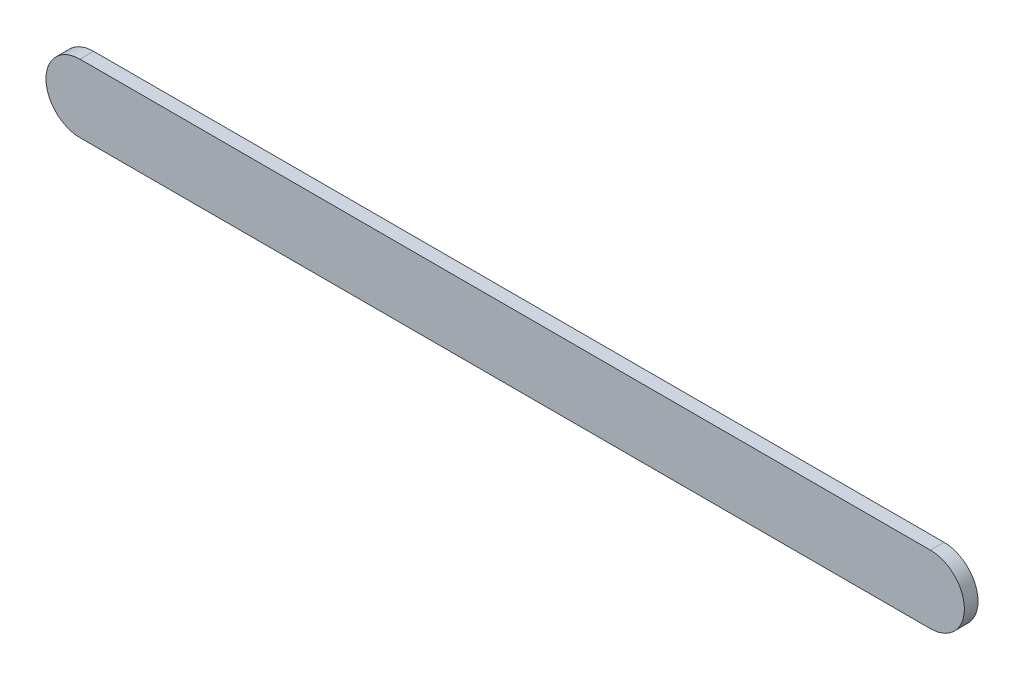
ISO-10303-21;
HEADER;
FILE_DESCRIPTION(('STEP AP214'),'2;1');
FILE_NAME('part.step','',(''),(''),'','','');
FILE_SCHEMA(('AUTOMOTIVE_DESIGN { 1 0 10303 214 1 1 1 1 }'));
ENDSEC;
DATA;
#1=APPLICATION_CONTEXT('core data for automotive mechanical design processes');
#2=APPLICATION_PROTOCOL_DEFINITION('international standard','automotive_design',2000,#1);
#3=PRODUCT_CONTEXT('',#1,'mechanical');
#4=PRODUCT('Part','Part','',(#3));
#5=PRODUCT_RELATED_PRODUCT_CATEGORY('part','',(#4));
#6=PRODUCT_DEFINITION_FORMATION('','',#4);
#7=PRODUCT_DEFINITION_CONTEXT('part definition',#1,'design');
#8=PRODUCT_DEFINITION('design','',#6,#7);
#9=PRODUCT_DEFINITION_SHAPE('','',#8);
#10=(LENGTH_UNIT() NAMED_UNIT(*) SI_UNIT(.MILLI.,.METRE.));
#11=(NAMED_UNIT(*) PLANE_ANGLE_UNIT() SI_UNIT($,.RADIAN.));
#12=(NAMED_UNIT(*) SI_UNIT($,.STERADIAN.) SOLID_ANGLE_UNIT());
#13=UNCERTAINTY_MEASURE_WITH_UNIT(LENGTH_MEASURE(1.E-05),#10,'distance_accuracy_value','');
#14=(GEOMETRIC_REPRESENTATION_CONTEXT(3) GLOBAL_UNCERTAINTY_ASSIGNED_CONTEXT((#13)) GLOBAL_UNIT_ASSIGNED_CONTEXT((#10,
#11,#12)) REPRESENTATION_CONTEXT('',''));
#15=CARTESIAN_POINT('',(0.,0.,0.));
#16=DIRECTION('',(0.,0.,1.));
#17=DIRECTION('',(1.,0.,0.));
#18=AXIS2_PLACEMENT_3D('',#15,#16,#17);
#19=CARTESIAN_POINT('',(0.,0.,1.));
#20=DIRECTION('',(0.,0.,-1.));
#21=DIRECTION('',(-1.,0.,0.));
#22=AXIS2_PLACEMENT_3D('',#19,#20,#21);
#23=CYLINDRICAL_SURFACE('',#22,5.);
#24=CARTESIAN_POINT('',(0.,0.,-1.));
#25=DIRECTION('',(0.,0.,1.));
#26=DIRECTION('',(1.,0.,0.));
#27=AXIS2_PLACEMENT_3D('',#24,#25,#26);
#28=CIRCLE('',#27,5.);
#29=CARTESIAN_POINT('',(0.,5.,-1.));
#30=VERTEX_POINT('',#29);
#31=CARTESIAN_POINT('',(0.,-5.,-1.));
#32=VERTEX_POINT('',#31);
#33=EDGE_CURVE('E102',#30,#32,#28,.T.);
#34=ORIENTED_EDGE('',*,*,#33,.T.);
#35=DIRECTION('',(0.,0.,-1.));
#36=VECTOR('',#35,1.);
#37=CARTESIAN_POINT('',(0.,-5.,1.));
#38=LINE('',#37,#36);
#39=CARTESIAN_POINT('',(0.,-5.,1.));
#40=VERTEX_POINT('',#39);
#41=EDGE_CURVE('E11',#40,#32,#38,.T.);
#42=ORIENTED_EDGE('',*,*,#41,.F.);
#43=CARTESIAN_POINT('',(0.,0.,1.));
#44=DIRECTION('',(0.,0.,1.));
#45=DIRECTION('',(1.,0.,0.));
#46=AXIS2_PLACEMENT_3D('',#43,#44,#45);
#47=CIRCLE('',#46,5.);
#48=CARTESIAN_POINT('',(0.,5.,1.));
#49=VERTEX_POINT('',#48);
#50=EDGE_CURVE('E90',#49,#40,#47,.T.);
#51=ORIENTED_EDGE('',*,*,#50,.F.);
#52=DIRECTION('',(0.,0.,-1.));
#53=VECTOR('',#52,1.);
#54=CARTESIAN_POINT('',(0.,5.,1.));
#55=LINE('',#54,#53);
#56=EDGE_CURVE('E98',#49,#30,#55,.T.);
#57=ORIENTED_EDGE('',*,*,#56,.T.);
#58=EDGE_LOOP('',(#34,#42,#51,#57));
#59=FACE_BOUND('',#58,.T.);
#60=ADVANCED_FACE('F39',(#59),#23,.T.);
#61=CARTESIAN_POINT('',(0.,-5.,1.));
#62=DIRECTION('',(0.,1.,0.));
#63=DIRECTION('',(0.,0.,1.));
#64=AXIS2_PLACEMENT_3D('',#61,#62,#63);
#65=PLANE('',#64);
#66=DIRECTION('',(1.,0.,0.));
#67=VECTOR('',#66,1.);
#68=CARTESIAN_POINT('',(0.,-5.,-1.));
#69=LINE('',#68,#67);
#70=CARTESIAN_POINT('',(125.,-5.,-1.));
#71=VERTEX_POINT('',#70);
#72=EDGE_CURVE('E94',#32,#71,#69,.T.);
#73=ORIENTED_EDGE('',*,*,#72,.T.);
#74=DIRECTION('',(0.,0.,-1.));
#75=VECTOR('',#74,1.);
#76=CARTESIAN_POINT('',(125.,-5.,1.));
#77=LINE('',#76,#75);
#78=CARTESIAN_POINT('',(125.,-5.,1.));
#79=VERTEX_POINT('',#78);
#80=EDGE_CURVE('E47',#79,#71,#77,.T.);
#81=ORIENTED_EDGE('',*,*,#80,.F.);
#82=DIRECTION('',(1.,0.,0.));
#83=VECTOR('',#82,1.);
#84=CARTESIAN_POINT('',(0.,-5.,1.));
#85=LINE('',#84,#83);
#86=EDGE_CURVE('E85',#40,#79,#85,.T.);
#87=ORIENTED_EDGE('',*,*,#86,.F.);
#88=ORIENTED_EDGE('',*,*,#41,.T.);
#89=EDGE_LOOP('',(#73,#81,#87,#88));
#90=FACE_BOUND('',#89,.T.);
#91=ADVANCED_FACE('F93',(#90),#65,.F.);
#92=CARTESIAN_POINT('',(125.,0.,1.));
#93=DIRECTION('',(0.,0.,-1.));
#94=DIRECTION('',(-1.,0.,0.));
#95=AXIS2_PLACEMENT_3D('',#92,#93,#94);
#96=CYLINDRICAL_SURFACE('',#95,5.);
#97=CARTESIAN_POINT('',(125.,0.,-1.));
#98=DIRECTION('',(0.,0.,1.));
#99=DIRECTION('',(1.,0.,0.));
#100=AXIS2_PLACEMENT_3D('',#97,#98,#99);
#101=CIRCLE('',#100,5.);
#102=CARTESIAN_POINT('',(125.,5.,-1.));
#103=VERTEX_POINT('',#102);
#104=EDGE_CURVE('E72',#71,#103,#101,.T.);
#105=ORIENTED_EDGE('',*,*,#104,.T.);
#106=DIRECTION('',(0.,0.,-1.));
#107=VECTOR('',#106,1.);
#108=CARTESIAN_POINT('',(125.,5.,1.));
#109=LINE('',#108,#107);
#110=CARTESIAN_POINT('',(125.,5.,1.));
#111=VERTEX_POINT('',#110);
#112=EDGE_CURVE('E95',#111,#103,#109,.T.);
#113=ORIENTED_EDGE('',*,*,#112,.F.);
#114=CARTESIAN_POINT('',(125.,0.,1.));
#115=DIRECTION('',(0.,0.,1.));
#116=DIRECTION('',(1.,0.,0.));
#117=AXIS2_PLACEMENT_3D('',#114,#115,#116);
#118=CIRCLE('',#117,5.);
#119=EDGE_CURVE('E88',#79,#111,#118,.T.);
#120=ORIENTED_EDGE('',*,*,#119,.F.);
#121=ORIENTED_EDGE('',*,*,#80,.T.);
#122=EDGE_LOOP('',(#105,#113,#120,#121));
#123=FACE_BOUND('',#122,.T.);
#124=ADVANCED_FACE('F96',(#123),#96,.T.);
#125=CARTESIAN_POINT('',(0.,5.,1.));
#126=DIRECTION('',(0.,-1.,0.));
#127=DIRECTION('',(0.,0.,-1.));
#128=AXIS2_PLACEMENT_3D('',#125,#126,#127);
#129=PLANE('',#128);
#130=DIRECTION('',(-1.,0.,0.));
#131=VECTOR('',#130,1.);
#132=CARTESIAN_POINT('',(0.,5.,-1.));
#133=LINE('',#132,#131);
#134=EDGE_CURVE('E78',#103,#30,#133,.T.);
#135=ORIENTED_EDGE('',*,*,#134,.T.);
#136=ORIENTED_EDGE('',*,*,#56,.F.);
#137=DIRECTION('',(-1.,0.,0.));
#138=VECTOR('',#137,1.);
#139=CARTESIAN_POINT('',(0.,5.,1.));
#140=LINE('',#139,#138);
#141=EDGE_CURVE('E55',#111,#49,#140,.T.);
#142=ORIENTED_EDGE('',*,*,#141,.F.);
#143=ORIENTED_EDGE('',*,*,#112,.T.);
#144=EDGE_LOOP('',(#135,#136,#142,#143));
#145=FACE_BOUND('',#144,.T.);
#146=ADVANCED_FACE('F109',(#145),#129,.F.);
#147=CARTESIAN_POINT('',(0.,0.,1.));
#148=DIRECTION('',(0.,0.,1.));
#149=DIRECTION('',(1.,0.,0.));
#150=AXIS2_PLACEMENT_3D('',#147,#148,#149);
#151=PLANE('',#150);
#152=ORIENTED_EDGE('',*,*,#50,.T.);
#153=ORIENTED_EDGE('',*,*,#86,.T.);
#154=ORIENTED_EDGE('',*,*,#119,.T.);
#155=ORIENTED_EDGE('',*,*,#141,.T.);
#156=EDGE_LOOP('',(#152,#153,#154,#155));
#157=FACE_BOUND('',#156,.T.);
#158=ADVANCED_FACE('F86',(#157),#151,.T.);
#159=CARTESIAN_POINT('',(0.,0.,-1.));
#160=DIRECTION('',(0.,0.,1.));
#161=DIRECTION('',(1.,0.,0.));
#162=AXIS2_PLACEMENT_3D('',#159,#160,#161);
#163=PLANE('',#162);
#164=ORIENTED_EDGE('',*,*,#33,.F.);
#165=ORIENTED_EDGE('',*,*,#134,.F.);
#166=ORIENTED_EDGE('',*,*,#104,.F.);
#167=ORIENTED_EDGE('',*,*,#72,.F.);
#168=EDGE_LOOP('',(#164,#165,#166,#167));
#169=FACE_BOUND('',#168,.T.);
#170=ADVANCED_FACE('F112',(#169),#163,.F.);
#171=CLOSED_SHELL('',(#60,#91,#124,#146,#158,#170));
#172=MANIFOLD_SOLID_BREP('B2',#171);
#173=ADVANCED_BREP_SHAPE_REPRESENTATION('',(#18,#172),#14);
#174=SHAPE_DEFINITION_REPRESENTATION(#9,#173);
ENDSEC;
END-ISO-10303-21;
